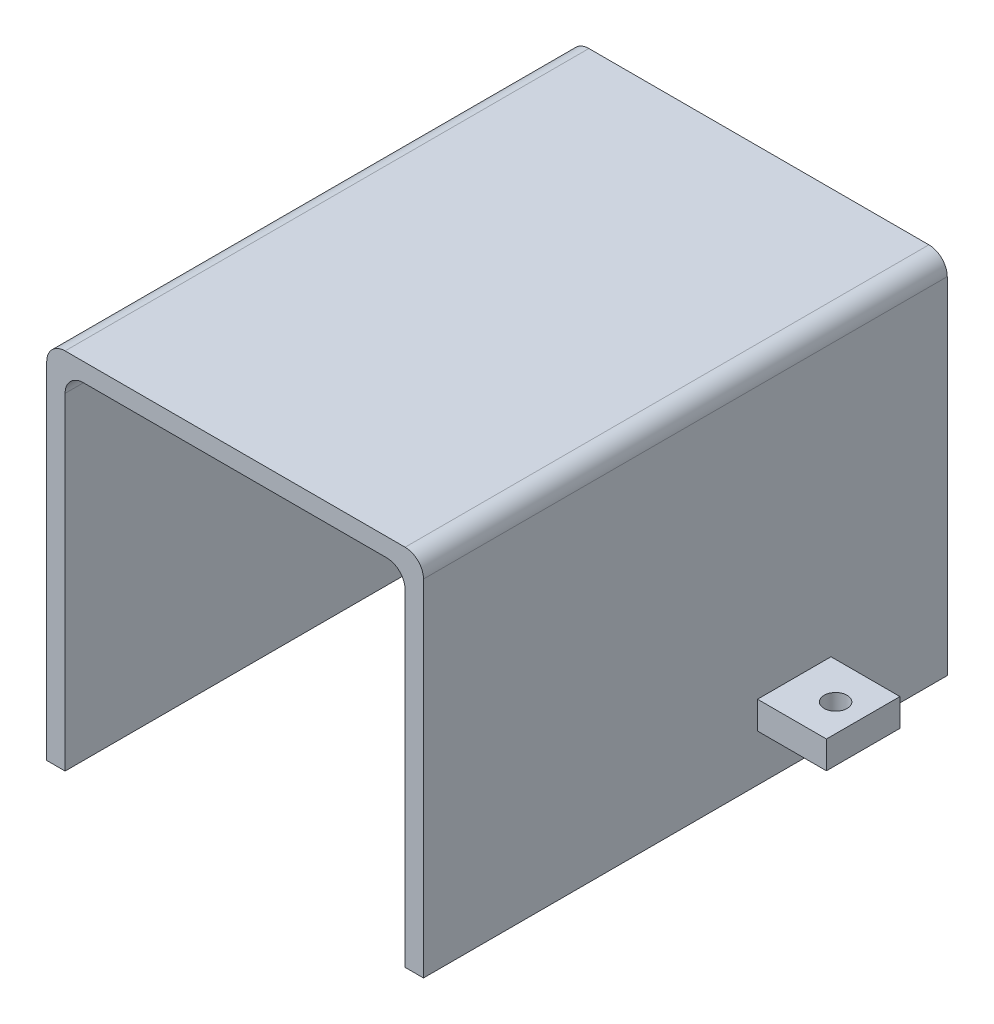
ISO-10303-21;
HEADER;
FILE_DESCRIPTION(('STEP AP214'),'2;1');
FILE_NAME('part.step','',(''),(''),'','','');
FILE_SCHEMA(('AUTOMOTIVE_DESIGN { 1 0 10303 214 1 1 1 1 }'));
ENDSEC;
DATA;
#1=APPLICATION_CONTEXT('core data for automotive mechanical design processes');
#2=APPLICATION_PROTOCOL_DEFINITION('international standard','automotive_design',2000,#1);
#3=PRODUCT_CONTEXT('',#1,'mechanical');
#4=PRODUCT('Part','Part','',(#3));
#5=PRODUCT_RELATED_PRODUCT_CATEGORY('part','',(#4));
#6=PRODUCT_DEFINITION_FORMATION('','',#4);
#7=PRODUCT_DEFINITION_CONTEXT('part definition',#1,'design');
#8=PRODUCT_DEFINITION('design','',#6,#7);
#9=PRODUCT_DEFINITION_SHAPE('','',#8);
#10=(LENGTH_UNIT() NAMED_UNIT(*) SI_UNIT(.MILLI.,.METRE.));
#11=(NAMED_UNIT(*) PLANE_ANGLE_UNIT() SI_UNIT($,.RADIAN.));
#12=(NAMED_UNIT(*) SI_UNIT($,.STERADIAN.) SOLID_ANGLE_UNIT());
#13=UNCERTAINTY_MEASURE_WITH_UNIT(LENGTH_MEASURE(1.E-05),#10,'distance_accuracy_value','');
#14=(GEOMETRIC_REPRESENTATION_CONTEXT(3) GLOBAL_UNCERTAINTY_ASSIGNED_CONTEXT((#13)) GLOBAL_UNIT_ASSIGNED_CONTEXT((#10,
#11,#12)) REPRESENTATION_CONTEXT('',''));
#15=CARTESIAN_POINT('',(0.,0.,0.));
#16=DIRECTION('',(0.,0.,1.));
#17=DIRECTION('',(1.,0.,0.));
#18=AXIS2_PLACEMENT_3D('',#15,#16,#17);
#19=CARTESIAN_POINT('',(-20.5,-5.5,-4.00000000000001));
#20=DIRECTION('',(0.,0.,-1.));
#21=DIRECTION('',(-1.,0.,0.));
#22=AXIS2_PLACEMENT_3D('',#19,#20,#21);
#23=PLANE('',#22);
#24=DIRECTION('',(1.,0.,0.));
#25=VECTOR('',#24,1.);
#26=CARTESIAN_POINT('',(-20.5,-8.5,-4.00000000000001));
#27=LINE('',#26,#25);
#28=CARTESIAN_POINT('',(-28.,-8.5,-3.99999999999999));
#29=VERTEX_POINT('',#28);
#30=CARTESIAN_POINT('',(-20.5,-8.5,-4.00000000000001));
#31=VERTEX_POINT('',#30);
#32=EDGE_CURVE('E111',#29,#31,#27,.T.);
#33=ORIENTED_EDGE('',*,*,#32,.F.);
#34=DIRECTION('',(0.,-1.,0.));
#35=VECTOR('',#34,1.);
#36=CARTESIAN_POINT('',(-28.,-5.5,-3.99999999999999));
#37=LINE('',#36,#35);
#38=CARTESIAN_POINT('',(-28.,-5.5,-3.99999999999999));
#39=VERTEX_POINT('',#38);
#40=EDGE_CURVE('E12',#39,#29,#37,.T.);
#41=ORIENTED_EDGE('',*,*,#40,.F.);
#42=DIRECTION('',(1.,0.,0.));
#43=VECTOR('',#42,1.);
#44=CARTESIAN_POINT('',(-20.5,-5.5,-4.00000000000001));
#45=LINE('',#44,#43);
#46=CARTESIAN_POINT('',(-20.5,-5.5,-4.00000000000001));
#47=VERTEX_POINT('',#46);
#48=EDGE_CURVE('E104',#39,#47,#45,.T.);
#49=ORIENTED_EDGE('',*,*,#48,.T.);
#50=DIRECTION('',(0.,-1.,0.));
#51=VECTOR('',#50,1.);
#52=CARTESIAN_POINT('',(-20.5,-5.5,-4.00000000000001));
#53=LINE('',#52,#51);
#54=EDGE_CURVE('E49',#47,#31,#53,.T.);
#55=ORIENTED_EDGE('',*,*,#54,.T.);
#56=EDGE_LOOP('',(#33,#41,#49,#55));
#57=FACE_BOUND('',#56,.T.);
#58=ADVANCED_FACE('F46',(#57),#23,.T.);
#59=CARTESIAN_POINT('',(-28.,-5.5,-3.99999999999999));
#60=DIRECTION('',(-1.,0.,0.));
#61=DIRECTION('',(0.,0.,1.));
#62=AXIS2_PLACEMENT_3D('',#59,#60,#61);
#63=PLANE('',#62);
#64=DIRECTION('',(0.,0.,-1.));
#65=VECTOR('',#64,1.);
#66=CARTESIAN_POINT('',(-28.,-8.5,-3.99999999999999));
#67=LINE('',#66,#65);
#68=CARTESIAN_POINT('',(-28.,-8.5,3.99999999999999));
#69=VERTEX_POINT('',#68);
#70=EDGE_CURVE('E106',#69,#29,#67,.T.);
#71=ORIENTED_EDGE('',*,*,#70,.F.);
#72=DIRECTION('',(0.,-1.,0.));
#73=VECTOR('',#72,1.);
#74=CARTESIAN_POINT('',(-28.,-5.5,3.99999999999999));
#75=LINE('',#74,#73);
#76=CARTESIAN_POINT('',(-28.,-5.5,3.99999999999999));
#77=VERTEX_POINT('',#76);
#78=EDGE_CURVE('E55',#77,#69,#75,.T.);
#79=ORIENTED_EDGE('',*,*,#78,.F.);
#80=DIRECTION('',(0.,0.,-1.));
#81=VECTOR('',#80,1.);
#82=CARTESIAN_POINT('',(-28.,-5.5,-3.99999999999999));
#83=LINE('',#82,#81);
#84=EDGE_CURVE('E101',#77,#39,#83,.T.);
#85=ORIENTED_EDGE('',*,*,#84,.T.);
#86=ORIENTED_EDGE('',*,*,#40,.T.);
#87=EDGE_LOOP('',(#71,#79,#85,#86));
#88=FACE_BOUND('',#87,.T.);
#89=ADVANCED_FACE('F122',(#88),#63,.T.);
#90=CARTESIAN_POINT('',(-20.5,-5.5,4.00000000000001));
#91=DIRECTION('',(0.,0.,1.));
#92=DIRECTION('',(1.,0.,0.));
#93=AXIS2_PLACEMENT_3D('',#90,#91,#92);
#94=PLANE('',#93);
#95=DIRECTION('',(-1.,0.,0.));
#96=VECTOR('',#95,1.);
#97=CARTESIAN_POINT('',(-20.5,-8.5,4.00000000000001));
#98=LINE('',#97,#96);
#99=CARTESIAN_POINT('',(-20.5,-8.5,4.00000000000001));
#100=VERTEX_POINT('',#99);
#101=EDGE_CURVE('E96',#100,#69,#98,.T.);
#102=ORIENTED_EDGE('',*,*,#101,.F.);
#103=DIRECTION('',(0.,-1.,0.));
#104=VECTOR('',#103,1.);
#105=CARTESIAN_POINT('',(-20.5,-5.5,4.00000000000001));
#106=LINE('',#105,#104);
#107=CARTESIAN_POINT('',(-20.5,-5.5,4.00000000000001));
#108=VERTEX_POINT('',#107);
#109=EDGE_CURVE('E91',#108,#100,#106,.T.);
#110=ORIENTED_EDGE('',*,*,#109,.F.);
#111=DIRECTION('',(-1.,0.,0.));
#112=VECTOR('',#111,1.);
#113=CARTESIAN_POINT('',(-20.5,-5.5,4.00000000000001));
#114=LINE('',#113,#112);
#115=EDGE_CURVE('E94',#108,#77,#114,.T.);
#116=ORIENTED_EDGE('',*,*,#115,.T.);
#117=ORIENTED_EDGE('',*,*,#78,.T.);
#118=EDGE_LOOP('',(#102,#110,#116,#117));
#119=FACE_BOUND('',#118,.T.);
#120=ADVANCED_FACE('F93',(#119),#94,.T.);
#121=CARTESIAN_POINT('',(-20.5,-5.5,-4.00000000000001));
#122=DIRECTION('',(1.,0.,0.));
#123=DIRECTION('',(0.,0.,-1.));
#124=AXIS2_PLACEMENT_3D('',#121,#122,#123);
#125=PLANE('',#124);
#126=DIRECTION('',(0.,0.,1.));
#127=VECTOR('',#126,1.);
#128=CARTESIAN_POINT('',(-20.5,-8.5,-4.00000000000001));
#129=LINE('',#128,#127);
#130=EDGE_CURVE('E114',#31,#100,#129,.T.);
#131=ORIENTED_EDGE('',*,*,#130,.F.);
#132=ORIENTED_EDGE('',*,*,#54,.F.);
#133=DIRECTION('',(0.,0.,1.));
#134=VECTOR('',#133,1.);
#135=CARTESIAN_POINT('',(-20.5,-5.5,-4.00000000000001));
#136=LINE('',#135,#134);
#137=EDGE_CURVE('E100',#47,#108,#136,.T.);
#138=ORIENTED_EDGE('',*,*,#137,.T.);
#139=ORIENTED_EDGE('',*,*,#109,.T.);
#140=EDGE_LOOP('',(#131,#132,#138,#139));
#141=FACE_BOUND('',#140,.T.);
#142=ADVANCED_FACE('F103',(#141),#125,.T.);
#143=CARTESIAN_POINT('',(0.,-5.5,0.));
#144=DIRECTION('',(0.,1.,0.));
#145=DIRECTION('',(0.,0.,1.));
#146=AXIS2_PLACEMENT_3D('',#143,#144,#145);
#147=PLANE('',#146);
#148=CARTESIAN_POINT('',(-25.,-5.5,0.));
#149=DIRECTION('',(0.,-1.,0.));
#150=DIRECTION('',(0.,0.,-1.));
#151=AXIS2_PLACEMENT_3D('',#148,#149,#150);
#152=CIRCLE('',#151,1.25);
#153=CARTESIAN_POINT('',(-25.,-5.5,-1.25000000000001));
#154=VERTEX_POINT('',#153);
#155=EDGE_CURVE('E115',#154,#154,#152,.T.);
#156=ORIENTED_EDGE('',*,*,#155,.T.);
#157=EDGE_LOOP('',(#156));
#158=FACE_BOUND('',#157,.T.);
#159=ORIENTED_EDGE('',*,*,#48,.F.);
#160=ORIENTED_EDGE('',*,*,#84,.F.);
#161=ORIENTED_EDGE('',*,*,#115,.F.);
#162=ORIENTED_EDGE('',*,*,#137,.F.);
#163=EDGE_LOOP('',(#159,#160,#161,#162));
#164=FACE_BOUND('',#163,.T.);
#165=ADVANCED_FACE('F99',(#158,#164),#147,.T.);
#166=CARTESIAN_POINT('',(0.,-8.5,0.));
#167=DIRECTION('',(0.,1.,0.));
#168=DIRECTION('',(0.,0.,1.));
#169=AXIS2_PLACEMENT_3D('',#166,#167,#168);
#170=PLANE('',#169);
#171=CARTESIAN_POINT('',(-25.,-8.5,0.));
#172=DIRECTION('',(0.,-1.,0.));
#173=DIRECTION('',(0.,0.,-1.));
#174=AXIS2_PLACEMENT_3D('',#171,#172,#173);
#175=CIRCLE('',#174,1.24999999999999);
#176=CARTESIAN_POINT('',(-25.,-8.5,-1.25));
#177=VERTEX_POINT('',#176);
#178=EDGE_CURVE('E152',#177,#177,#175,.T.);
#179=ORIENTED_EDGE('',*,*,#178,.F.);
#180=EDGE_LOOP('',(#179));
#181=FACE_BOUND('',#180,.T.);
#182=ORIENTED_EDGE('',*,*,#32,.T.);
#183=ORIENTED_EDGE('',*,*,#130,.T.);
#184=ORIENTED_EDGE('',*,*,#101,.T.);
#185=ORIENTED_EDGE('',*,*,#70,.T.);
#186=EDGE_LOOP('',(#182,#183,#184,#185));
#187=FACE_BOUND('',#186,.T.);
#188=ADVANCED_FACE('F121',(#181,#187),#170,.F.);
#189=CARTESIAN_POINT('',(-25.,-8.5,0.));
#190=DIRECTION('',(0.,-1.,0.));
#191=DIRECTION('',(0.,0.,-1.));
#192=AXIS2_PLACEMENT_3D('',#189,#190,#191);
#193=CYLINDRICAL_SURFACE('',#192,1.24999999999999);
#194=ORIENTED_EDGE('',*,*,#155,.F.);
#195=EDGE_LOOP('',(#194));
#196=FACE_BOUND('',#195,.T.);
#197=ORIENTED_EDGE('',*,*,#178,.T.);
#198=EDGE_LOOP('',(#197));
#199=FACE_BOUND('',#198,.T.);
#200=ADVANCED_FACE('F140',(#196,#199),#193,.F.);
#201=CLOSED_SHELL('',(#58,#89,#120,#142,#165,#188,#200));
#202=MANIFOLD_SOLID_BREP('B2',#201);
#203=CARTESIAN_POINT('',(20.5,-5.5,-4.));
#204=DIRECTION('',(-1.,0.,0.));
#205=DIRECTION('',(0.,0.,1.));
#206=AXIS2_PLACEMENT_3D('',#203,#204,#205);
#207=PLANE('',#206);
#208=DIRECTION('',(0.,0.,-1.));
#209=VECTOR('',#208,1.);
#210=CARTESIAN_POINT('',(20.5,-8.5,-4.));
#211=LINE('',#210,#209);
#212=CARTESIAN_POINT('',(20.5,-8.5,4.));
#213=VERTEX_POINT('',#212);
#214=CARTESIAN_POINT('',(20.5,-8.5,-4.));
#215=VERTEX_POINT('',#214);
#216=EDGE_CURVE('E265',#213,#215,#211,.T.);
#217=ORIENTED_EDGE('',*,*,#216,.F.);
#218=DIRECTION('',(0.,-1.,0.));
#219=VECTOR('',#218,1.);
#220=CARTESIAN_POINT('',(20.5,-5.5,4.));
#221=LINE('',#220,#219);
#222=CARTESIAN_POINT('',(20.5,-5.5,4.));
#223=VERTEX_POINT('',#222);
#224=EDGE_CURVE('E44',#223,#213,#221,.T.);
#225=ORIENTED_EDGE('',*,*,#224,.F.);
#226=DIRECTION('',(0.,0.,-1.));
#227=VECTOR('',#226,1.);
#228=CARTESIAN_POINT('',(20.5,-5.5,-4.));
#229=LINE('',#228,#227);
#230=CARTESIAN_POINT('',(20.5,-5.5,-4.));
#231=VERTEX_POINT('',#230);
#232=EDGE_CURVE('E258',#223,#231,#229,.T.);
#233=ORIENTED_EDGE('',*,*,#232,.T.);
#234=DIRECTION('',(0.,-1.,0.));
#235=VECTOR('',#234,1.);
#236=CARTESIAN_POINT('',(20.5,-5.5,-4.));
#237=LINE('',#236,#235);
#238=EDGE_CURVE('E203',#231,#215,#237,.T.);
#239=ORIENTED_EDGE('',*,*,#238,.T.);
#240=EDGE_LOOP('',(#217,#225,#233,#239));
#241=FACE_BOUND('',#240,.T.);
#242=ADVANCED_FACE('F200',(#241),#207,.T.);
#243=CARTESIAN_POINT('',(20.5,-5.5,4.));
#244=DIRECTION('',(0.,0.,1.));
#245=DIRECTION('',(1.,0.,0.));
#246=AXIS2_PLACEMENT_3D('',#243,#244,#245);
#247=PLANE('',#246);
#248=DIRECTION('',(-1.,0.,0.));
#249=VECTOR('',#248,1.);
#250=CARTESIAN_POINT('',(20.5,-8.5,4.));
#251=LINE('',#250,#249);
#252=CARTESIAN_POINT('',(28.,-8.5,4.));
#253=VERTEX_POINT('',#252);
#254=EDGE_CURVE('E260',#253,#213,#251,.T.);
#255=ORIENTED_EDGE('',*,*,#254,.F.);
#256=DIRECTION('',(0.,-1.,0.));
#257=VECTOR('',#256,1.);
#258=CARTESIAN_POINT('',(28.,-5.5,4.));
#259=LINE('',#258,#257);
#260=CARTESIAN_POINT('',(28.,-5.5,4.));
#261=VERTEX_POINT('',#260);
#262=EDGE_CURVE('E209',#261,#253,#259,.T.);
#263=ORIENTED_EDGE('',*,*,#262,.F.);
#264=DIRECTION('',(-1.,0.,0.));
#265=VECTOR('',#264,1.);
#266=CARTESIAN_POINT('',(20.5,-5.5,4.));
#267=LINE('',#266,#265);
#268=EDGE_CURVE('E255',#261,#223,#267,.T.);
#269=ORIENTED_EDGE('',*,*,#268,.T.);
#270=ORIENTED_EDGE('',*,*,#224,.T.);
#271=EDGE_LOOP('',(#255,#263,#269,#270));
#272=FACE_BOUND('',#271,.T.);
#273=ADVANCED_FACE('F276',(#272),#247,.T.);
#274=CARTESIAN_POINT('',(28.,-5.5,-4.));
#275=DIRECTION('',(1.,0.,0.));
#276=DIRECTION('',(0.,0.,-1.));
#277=AXIS2_PLACEMENT_3D('',#274,#275,#276);
#278=PLANE('',#277);
#279=DIRECTION('',(0.,0.,1.));
#280=VECTOR('',#279,1.);
#281=CARTESIAN_POINT('',(28.,-8.5,-4.));
#282=LINE('',#281,#280);
#283=CARTESIAN_POINT('',(28.,-8.5,-4.));
#284=VERTEX_POINT('',#283);
#285=EDGE_CURVE('E250',#284,#253,#282,.T.);
#286=ORIENTED_EDGE('',*,*,#285,.F.);
#287=DIRECTION('',(0.,-1.,0.));
#288=VECTOR('',#287,1.);
#289=CARTESIAN_POINT('',(28.,-5.5,-4.));
#290=LINE('',#289,#288);
#291=CARTESIAN_POINT('',(28.,-5.5,-4.));
#292=VERTEX_POINT('',#291);
#293=EDGE_CURVE('E245',#292,#284,#290,.T.);
#294=ORIENTED_EDGE('',*,*,#293,.F.);
#295=DIRECTION('',(0.,0.,1.));
#296=VECTOR('',#295,1.);
#297=CARTESIAN_POINT('',(28.,-5.5,-4.));
#298=LINE('',#297,#296);
#299=EDGE_CURVE('E248',#292,#261,#298,.T.);
#300=ORIENTED_EDGE('',*,*,#299,.T.);
#301=ORIENTED_EDGE('',*,*,#262,.T.);
#302=EDGE_LOOP('',(#286,#294,#300,#301));
#303=FACE_BOUND('',#302,.T.);
#304=ADVANCED_FACE('F247',(#303),#278,.T.);
#305=CARTESIAN_POINT('',(20.5,-5.5,-4.));
#306=DIRECTION('',(0.,0.,-1.));
#307=DIRECTION('',(-1.,0.,0.));
#308=AXIS2_PLACEMENT_3D('',#305,#306,#307);
#309=PLANE('',#308);
#310=DIRECTION('',(1.,0.,0.));
#311=VECTOR('',#310,1.);
#312=CARTESIAN_POINT('',(20.5,-8.5,-4.));
#313=LINE('',#312,#311);
#314=EDGE_CURVE('E268',#215,#284,#313,.T.);
#315=ORIENTED_EDGE('',*,*,#314,.F.);
#316=ORIENTED_EDGE('',*,*,#238,.F.);
#317=DIRECTION('',(1.,0.,0.));
#318=VECTOR('',#317,1.);
#319=CARTESIAN_POINT('',(20.5,-5.5,-4.));
#320=LINE('',#319,#318);
#321=EDGE_CURVE('E254',#231,#292,#320,.T.);
#322=ORIENTED_EDGE('',*,*,#321,.T.);
#323=ORIENTED_EDGE('',*,*,#293,.T.);
#324=EDGE_LOOP('',(#315,#316,#322,#323));
#325=FACE_BOUND('',#324,.T.);
#326=ADVANCED_FACE('F257',(#325),#309,.T.);
#327=CARTESIAN_POINT('',(0.,-5.5,0.));
#328=DIRECTION('',(0.,1.,0.));
#329=DIRECTION('',(0.,0.,1.));
#330=AXIS2_PLACEMENT_3D('',#327,#328,#329);
#331=PLANE('',#330);
#332=CARTESIAN_POINT('',(25.,-5.5,0.));
#333=DIRECTION('',(0.,-1.,0.));
#334=DIRECTION('',(0.,0.,-1.));
#335=AXIS2_PLACEMENT_3D('',#332,#333,#334);
#336=CIRCLE('',#335,1.25);
#337=CARTESIAN_POINT('',(25.,-5.5,-1.25));
#338=VERTEX_POINT('',#337);
#339=EDGE_CURVE('E269',#338,#338,#336,.T.);
#340=ORIENTED_EDGE('',*,*,#339,.T.);
#341=EDGE_LOOP('',(#340));
#342=FACE_BOUND('',#341,.T.);
#343=ORIENTED_EDGE('',*,*,#232,.F.);
#344=ORIENTED_EDGE('',*,*,#268,.F.);
#345=ORIENTED_EDGE('',*,*,#299,.F.);
#346=ORIENTED_EDGE('',*,*,#321,.F.);
#347=EDGE_LOOP('',(#343,#344,#345,#346));
#348=FACE_BOUND('',#347,.T.);
#349=ADVANCED_FACE('F253',(#342,#348),#331,.T.);
#350=CARTESIAN_POINT('',(0.,-8.5,0.));
#351=DIRECTION('',(0.,1.,0.));
#352=DIRECTION('',(0.,0.,1.));
#353=AXIS2_PLACEMENT_3D('',#350,#351,#352);
#354=PLANE('',#353);
#355=CARTESIAN_POINT('',(25.,-8.5,0.));
#356=DIRECTION('',(0.,-1.,0.));
#357=DIRECTION('',(0.,0.,-1.));
#358=AXIS2_PLACEMENT_3D('',#355,#356,#357);
#359=CIRCLE('',#358,1.24999999999999);
#360=CARTESIAN_POINT('',(25.,-8.5,-1.24999999999999));
#361=VERTEX_POINT('',#360);
#362=EDGE_CURVE('E306',#361,#361,#359,.T.);
#363=ORIENTED_EDGE('',*,*,#362,.F.);
#364=EDGE_LOOP('',(#363));
#365=FACE_BOUND('',#364,.T.);
#366=ORIENTED_EDGE('',*,*,#216,.T.);
#367=ORIENTED_EDGE('',*,*,#314,.T.);
#368=ORIENTED_EDGE('',*,*,#285,.T.);
#369=ORIENTED_EDGE('',*,*,#254,.T.);
#370=EDGE_LOOP('',(#366,#367,#368,#369));
#371=FACE_BOUND('',#370,.T.);
#372=ADVANCED_FACE('F275',(#365,#371),#354,.F.);
#373=CARTESIAN_POINT('',(25.,-8.5,0.));
#374=DIRECTION('',(0.,-1.,0.));
#375=DIRECTION('',(0.,0.,-1.));
#376=AXIS2_PLACEMENT_3D('',#373,#374,#375);
#377=CYLINDRICAL_SURFACE('',#376,1.24999999999999);
#378=ORIENTED_EDGE('',*,*,#339,.F.);
#379=EDGE_LOOP('',(#378));
#380=FACE_BOUND('',#379,.T.);
#381=ORIENTED_EDGE('',*,*,#362,.T.);
#382=EDGE_LOOP('',(#381));
#383=FACE_BOUND('',#382,.T.);
#384=ADVANCED_FACE('F294',(#380,#383),#377,.F.);
#385=CLOSED_SHELL('',(#242,#273,#304,#326,#349,#372,#384));
#386=MANIFOLD_SOLID_BREP('B6',#385);
#387=CARTESIAN_POINT('',(18.5,24.,-16.65));
#388=DIRECTION('',(-1.,0.,0.));
#389=DIRECTION('',(0.,0.,1.));
#390=AXIS2_PLACEMENT_3D('',#387,#388,#389);
#391=PLANE('',#390);
#392=DIRECTION('',(0.,-1.,0.));
#393=VECTOR('',#392,1.);
#394=CARTESIAN_POINT('',(18.5,24.,40.35));
#395=LINE('',#394,#393);
#396=CARTESIAN_POINT('',(18.5,22.,40.35));
#397=VERTEX_POINT('',#396);
#398=CARTESIAN_POINT('',(18.5,-13.6,40.35));
#399=VERTEX_POINT('',#398);
#400=EDGE_CURVE('E436',#397,#399,#395,.T.);
#401=ORIENTED_EDGE('',*,*,#400,.F.);
#402=DIRECTION('',(0.,0.,1.));
#403=VECTOR('',#402,1.);
#404=CARTESIAN_POINT('',(18.5,22.,-16.65));
#405=LINE('',#404,#403);
#406=CARTESIAN_POINT('',(18.5,22.,-16.65));
#407=VERTEX_POINT('',#406);
#408=EDGE_CURVE('E505',#397,#407,#405,.F.);
#409=ORIENTED_EDGE('',*,*,#408,.T.);
#410=DIRECTION('',(0.,-1.,0.));
#411=VECTOR('',#410,1.);
#412=CARTESIAN_POINT('',(18.5,24.,-16.65));
#413=LINE('',#412,#411);
#414=CARTESIAN_POINT('',(18.5,-13.6,-16.65));
#415=VERTEX_POINT('',#414);
#416=EDGE_CURVE('E452',#407,#415,#413,.T.);
#417=ORIENTED_EDGE('',*,*,#416,.T.);
#418=DIRECTION('',(0.,0.,1.));
#419=VECTOR('',#418,1.);
#420=CARTESIAN_POINT('',(18.5,-13.6,-16.65));
#421=LINE('',#420,#419);
#422=EDGE_CURVE('E450',#415,#399,#421,.T.);
#423=ORIENTED_EDGE('',*,*,#422,.T.);
#424=EDGE_LOOP('',(#401,#409,#417,#423));
#425=FACE_BOUND('',#424,.T.);
#426=ADVANCED_FACE('F345',(#425),#391,.T.);
#427=CARTESIAN_POINT('',(-18.5,24.,-16.65));
#428=DIRECTION('',(0.,-1.,0.));
#429=DIRECTION('',(0.,0.,-1.));
#430=AXIS2_PLACEMENT_3D('',#427,#428,#429);
#431=PLANE('',#430);
#432=DIRECTION('',(1.,0.,0.));
#433=VECTOR('',#432,1.);
#434=CARTESIAN_POINT('',(-18.5,24.,-16.65));
#435=LINE('',#434,#433);
#436=CARTESIAN_POINT('',(-16.5,24.,-16.65));
#437=VERTEX_POINT('',#436);
#438=CARTESIAN_POINT('',(16.5,24.,-16.65));
#439=VERTEX_POINT('',#438);
#440=EDGE_CURVE('E457',#437,#439,#435,.T.);
#441=ORIENTED_EDGE('',*,*,#440,.T.);
#442=DIRECTION('',(0.,0.,1.));
#443=VECTOR('',#442,1.);
#444=CARTESIAN_POINT('',(16.5,24.,40.35));
#445=LINE('',#444,#443);
#446=CARTESIAN_POINT('',(16.5,24.,40.35));
#447=VERTEX_POINT('',#446);
#448=EDGE_CURVE('E502',#439,#447,#445,.T.);
#449=ORIENTED_EDGE('',*,*,#448,.T.);
#450=DIRECTION('',(1.,0.,0.));
#451=VECTOR('',#450,1.);
#452=CARTESIAN_POINT('',(-18.5,24.,40.35));
#453=LINE('',#452,#451);
#454=CARTESIAN_POINT('',(-16.5,24.,40.35));
#455=VERTEX_POINT('',#454);
#456=EDGE_CURVE('E474',#455,#447,#453,.T.);
#457=ORIENTED_EDGE('',*,*,#456,.F.);
#458=DIRECTION('',(0.,0.,1.));
#459=VECTOR('',#458,1.);
#460=CARTESIAN_POINT('',(-16.5,24.,-16.65));
#461=LINE('',#460,#459);
#462=EDGE_CURVE('E496',#455,#437,#461,.F.);
#463=ORIENTED_EDGE('',*,*,#462,.T.);
#464=EDGE_LOOP('',(#441,#449,#457,#463));
#465=FACE_BOUND('',#464,.T.);
#466=ADVANCED_FACE('F534',(#465),#431,.T.);
#467=CARTESIAN_POINT('',(-18.5,24.,-16.65));
#468=DIRECTION('',(1.,0.,0.));
#469=DIRECTION('',(0.,0.,-1.));
#470=AXIS2_PLACEMENT_3D('',#467,#468,#469);
#471=PLANE('',#470);
#472=DIRECTION('',(0.,1.,0.));
#473=VECTOR('',#472,1.);
#474=CARTESIAN_POINT('',(-18.5,24.,-16.65));
#475=LINE('',#474,#473);
#476=CARTESIAN_POINT('',(-18.5,-13.6,-16.65));
#477=VERTEX_POINT('',#476);
#478=CARTESIAN_POINT('',(-18.5,22.,-16.65));
#479=VERTEX_POINT('',#478);
#480=EDGE_CURVE('E489',#477,#479,#475,.T.);
#481=ORIENTED_EDGE('',*,*,#480,.T.);
#482=DIRECTION('',(0.,0.,1.));
#483=VECTOR('',#482,1.);
#484=CARTESIAN_POINT('',(-18.5,22.,40.35));
#485=LINE('',#484,#483);
#486=CARTESIAN_POINT('',(-18.5,22.,40.35));
#487=VERTEX_POINT('',#486);
#488=EDGE_CURVE('E507',#479,#487,#485,.T.);
#489=ORIENTED_EDGE('',*,*,#488,.T.);
#490=DIRECTION('',(0.,1.,0.));
#491=VECTOR('',#490,1.);
#492=CARTESIAN_POINT('',(-18.5,24.,40.35));
#493=LINE('',#492,#491);
#494=CARTESIAN_POINT('',(-18.5,-13.6,40.35));
#495=VERTEX_POINT('',#494);
#496=EDGE_CURVE('E471',#495,#487,#493,.T.);
#497=ORIENTED_EDGE('',*,*,#496,.F.);
#498=DIRECTION('',(0.,0.,1.));
#499=VECTOR('',#498,1.);
#500=CARTESIAN_POINT('',(-18.5,-13.6,-16.65));
#501=LINE('',#500,#499);
#502=EDGE_CURVE('E494',#477,#495,#501,.T.);
#503=ORIENTED_EDGE('',*,*,#502,.F.);
#504=EDGE_LOOP('',(#481,#489,#497,#503));
#505=FACE_BOUND('',#504,.T.);
#506=ADVANCED_FACE('F543',(#505),#471,.T.);
#507=CARTESIAN_POINT('',(-20.5,-13.6,-16.65));
#508=DIRECTION('',(0.,-1.,0.));
#509=DIRECTION('',(0.,0.,-1.));
#510=AXIS2_PLACEMENT_3D('',#507,#508,#509);
#511=PLANE('',#510);
#512=ORIENTED_EDGE('',*,*,#502,.T.);
#513=DIRECTION('',(1.,0.,0.));
#514=VECTOR('',#513,1.);
#515=CARTESIAN_POINT('',(-20.5,-13.6,40.35));
#516=LINE('',#515,#514);
#517=CARTESIAN_POINT('',(-20.5,-13.6,40.35));
#518=VERTEX_POINT('',#517);
#519=EDGE_CURVE('E468',#518,#495,#516,.T.);
#520=ORIENTED_EDGE('',*,*,#519,.F.);
#521=DIRECTION('',(0.,0.,1.));
#522=VECTOR('',#521,1.);
#523=CARTESIAN_POINT('',(-20.5,-13.6,-16.65));
#524=LINE('',#523,#522);
#525=CARTESIAN_POINT('',(-20.5,-13.6,-16.65));
#526=VERTEX_POINT('',#525);
#527=EDGE_CURVE('E497',#526,#518,#524,.T.);
#528=ORIENTED_EDGE('',*,*,#527,.F.);
#529=DIRECTION('',(1.,0.,0.));
#530=VECTOR('',#529,1.);
#531=CARTESIAN_POINT('',(-20.5,-13.6,-16.65));
#532=LINE('',#531,#530);
#533=EDGE_CURVE('E486',#526,#477,#532,.T.);
#534=ORIENTED_EDGE('',*,*,#533,.T.);
#535=EDGE_LOOP('',(#512,#520,#528,#534));
#536=FACE_BOUND('',#535,.T.);
#537=ADVANCED_FACE('F546',(#536),#511,.T.);
#538=CARTESIAN_POINT('',(-20.5,-13.6,-16.65));
#539=DIRECTION('',(-1.,0.,0.));
#540=DIRECTION('',(0.,0.,1.));
#541=AXIS2_PLACEMENT_3D('',#538,#539,#540);
#542=PLANE('',#541);
#543=DIRECTION('',(0.,-1.,0.));
#544=VECTOR('',#543,1.);
#545=CARTESIAN_POINT('',(-20.5,-13.6,40.35));
#546=LINE('',#545,#544);
#547=CARTESIAN_POINT('',(-20.5,24.,40.35));
#548=VERTEX_POINT('',#547);
#549=EDGE_CURVE('E466',#548,#518,#546,.T.);
#550=ORIENTED_EDGE('',*,*,#549,.F.);
#551=DIRECTION('',(0.,0.,1.));
#552=VECTOR('',#551,1.);
#553=CARTESIAN_POINT('',(-20.5,24.,-16.65));
#554=LINE('',#553,#552);
#555=CARTESIAN_POINT('',(-20.5,24.,-16.65));
#556=VERTEX_POINT('',#555);
#557=EDGE_CURVE('E368',#548,#556,#554,.F.);
#558=ORIENTED_EDGE('',*,*,#557,.T.);
#559=DIRECTION('',(0.,-1.,0.));
#560=VECTOR('',#559,1.);
#561=CARTESIAN_POINT('',(-20.5,-13.6,-16.65));
#562=LINE('',#561,#560);
#563=EDGE_CURVE('E484',#556,#526,#562,.T.);
#564=ORIENTED_EDGE('',*,*,#563,.T.);
#565=ORIENTED_EDGE('',*,*,#527,.T.);
#566=EDGE_LOOP('',(#550,#558,#564,#565));
#567=FACE_BOUND('',#566,.T.);
#568=ADVANCED_FACE('F548',(#567),#542,.T.);
#569=CARTESIAN_POINT('',(-20.5,26.,-16.65));
#570=DIRECTION('',(0.,1.,0.));
#571=DIRECTION('',(0.,0.,1.));
#572=AXIS2_PLACEMENT_3D('',#569,#570,#571);
#573=PLANE('',#572);
#574=DIRECTION('',(-1.,0.,0.));
#575=VECTOR('',#574,1.);
#576=CARTESIAN_POINT('',(-20.5,26.,-16.65));
#577=LINE('',#576,#575);
#578=CARTESIAN_POINT('',(18.5,26.,-16.65));
#579=VERTEX_POINT('',#578);
#580=CARTESIAN_POINT('',(-18.5,26.,-16.65));
#581=VERTEX_POINT('',#580);
#582=EDGE_CURVE('E481',#579,#581,#577,.T.);
#583=ORIENTED_EDGE('',*,*,#582,.T.);
#584=DIRECTION('',(0.,0.,1.));
#585=VECTOR('',#584,1.);
#586=CARTESIAN_POINT('',(-18.5,26.,-16.65));
#587=LINE('',#586,#585);
#588=CARTESIAN_POINT('',(-18.5,26.,40.35));
#589=VERTEX_POINT('',#588);
#590=EDGE_CURVE('E512',#581,#589,#587,.T.);
#591=ORIENTED_EDGE('',*,*,#590,.T.);
#592=DIRECTION('',(-1.,0.,0.));
#593=VECTOR('',#592,1.);
#594=CARTESIAN_POINT('',(-20.5,26.,40.35));
#595=LINE('',#594,#593);
#596=CARTESIAN_POINT('',(18.5,26.,40.35));
#597=VERTEX_POINT('',#596);
#598=EDGE_CURVE('E462',#597,#589,#595,.T.);
#599=ORIENTED_EDGE('',*,*,#598,.F.);
#600=DIRECTION('',(0.,0.,1.));
#601=VECTOR('',#600,1.);
#602=CARTESIAN_POINT('',(18.5,26.,-16.65));
#603=LINE('',#602,#601);
#604=EDGE_CURVE('E510',#597,#579,#603,.F.);
#605=ORIENTED_EDGE('',*,*,#604,.T.);
#606=EDGE_LOOP('',(#583,#591,#599,#605));
#607=FACE_BOUND('',#606,.T.);
#608=ADVANCED_FACE('F555',(#607),#573,.T.);
#609=CARTESIAN_POINT('',(20.5,-13.6,-16.65));
#610=DIRECTION('',(1.,0.,0.));
#611=DIRECTION('',(0.,0.,-1.));
#612=AXIS2_PLACEMENT_3D('',#609,#610,#611);
#613=PLANE('',#612);
#614=DIRECTION('',(0.,1.,0.));
#615=VECTOR('',#614,1.);
#616=CARTESIAN_POINT('',(20.5,-13.6,-16.65));
#617=LINE('',#616,#615);
#618=CARTESIAN_POINT('',(20.5,-13.6,-16.65));
#619=VERTEX_POINT('',#618);
#620=CARTESIAN_POINT('',(20.5,24.,-16.65));
#621=VERTEX_POINT('',#620);
#622=EDGE_CURVE('E479',#619,#621,#617,.T.);
#623=ORIENTED_EDGE('',*,*,#622,.T.);
#624=DIRECTION('',(0.,0.,1.));
#625=VECTOR('',#624,1.);
#626=CARTESIAN_POINT('',(20.5,24.,-16.65));
#627=LINE('',#626,#625);
#628=CARTESIAN_POINT('',(20.5,24.,40.35));
#629=VERTEX_POINT('',#628);
#630=EDGE_CURVE('E523',#621,#629,#627,.T.);
#631=ORIENTED_EDGE('',*,*,#630,.T.);
#632=DIRECTION('',(0.,1.,0.));
#633=VECTOR('',#632,1.);
#634=CARTESIAN_POINT('',(20.5,-13.6,40.35));
#635=LINE('',#634,#633);
#636=CARTESIAN_POINT('',(20.5,-13.6,40.35));
#637=VERTEX_POINT('',#636);
#638=EDGE_CURVE('E460',#637,#629,#635,.T.);
#639=ORIENTED_EDGE('',*,*,#638,.F.);
#640=DIRECTION('',(0.,0.,1.));
#641=VECTOR('',#640,1.);
#642=CARTESIAN_POINT('',(20.5,-13.6,-16.65));
#643=LINE('',#642,#641);
#644=EDGE_CURVE('E456',#619,#637,#643,.T.);
#645=ORIENTED_EDGE('',*,*,#644,.F.);
#646=EDGE_LOOP('',(#623,#631,#639,#645));
#647=FACE_BOUND('',#646,.T.);
#648=ADVANCED_FACE('F560',(#647),#613,.T.);
#649=CARTESIAN_POINT('',(18.5,-13.6,-16.65));
#650=DIRECTION('',(0.,-1.,0.));
#651=DIRECTION('',(0.,0.,-1.));
#652=AXIS2_PLACEMENT_3D('',#649,#650,#651);
#653=PLANE('',#652);
#654=ORIENTED_EDGE('',*,*,#644,.T.);
#655=DIRECTION('',(1.,0.,0.));
#656=VECTOR('',#655,1.);
#657=CARTESIAN_POINT('',(18.5,-13.6,40.35));
#658=LINE('',#657,#656);
#659=EDGE_CURVE('E442',#399,#637,#658,.T.);
#660=ORIENTED_EDGE('',*,*,#659,.F.);
#661=ORIENTED_EDGE('',*,*,#422,.F.);
#662=DIRECTION('',(1.,0.,0.));
#663=VECTOR('',#662,1.);
#664=CARTESIAN_POINT('',(18.5,-13.6,-16.65));
#665=LINE('',#664,#663);
#666=EDGE_CURVE('E477',#415,#619,#665,.T.);
#667=ORIENTED_EDGE('',*,*,#666,.T.);
#668=EDGE_LOOP('',(#654,#660,#661,#667));
#669=FACE_BOUND('',#668,.T.);
#670=ADVANCED_FACE('F459',(#669),#653,.T.);
#671=CARTESIAN_POINT('',(0.,0.,-16.65));
#672=DIRECTION('',(0.,0.,1.));
#673=DIRECTION('',(1.,0.,0.));
#674=AXIS2_PLACEMENT_3D('',#671,#672,#673);
#675=PLANE('',#674);
#676=ORIENTED_EDGE('',*,*,#563,.F.);
#677=CARTESIAN_POINT('',(-18.5,24.,-16.65));
#678=DIRECTION('',(0.,0.,1.));
#679=DIRECTION('',(1.,0.,0.));
#680=AXIS2_PLACEMENT_3D('',#677,#678,#679);
#681=CIRCLE('',#680,2.);
#682=EDGE_CURVE('E521',#556,#581,#681,.F.);
#683=ORIENTED_EDGE('',*,*,#682,.T.);
#684=ORIENTED_EDGE('',*,*,#582,.F.);
#685=CARTESIAN_POINT('',(18.5,24.,-16.65));
#686=DIRECTION('',(0.,0.,1.));
#687=DIRECTION('',(1.,0.,0.));
#688=AXIS2_PLACEMENT_3D('',#685,#686,#687);
#689=CIRCLE('',#688,2.);
#690=EDGE_CURVE('E360',#579,#621,#689,.F.);
#691=ORIENTED_EDGE('',*,*,#690,.T.);
#692=ORIENTED_EDGE('',*,*,#622,.F.);
#693=ORIENTED_EDGE('',*,*,#666,.F.);
#694=ORIENTED_EDGE('',*,*,#416,.F.);
#695=CARTESIAN_POINT('',(16.5,22.,-16.65));
#696=DIRECTION('',(0.,0.,1.));
#697=DIRECTION('',(1.,0.,0.));
#698=AXIS2_PLACEMENT_3D('',#695,#696,#697);
#699=CIRCLE('',#698,2.);
#700=EDGE_CURVE('E527',#407,#439,#699,.T.);
#701=ORIENTED_EDGE('',*,*,#700,.T.);
#702=ORIENTED_EDGE('',*,*,#440,.F.);
#703=CARTESIAN_POINT('',(-16.5,22.,-16.65));
#704=DIRECTION('',(0.,0.,1.));
#705=DIRECTION('',(1.,0.,0.));
#706=AXIS2_PLACEMENT_3D('',#703,#704,#705);
#707=CIRCLE('',#706,2.);
#708=EDGE_CURVE('E198',#437,#479,#707,.T.);
#709=ORIENTED_EDGE('',*,*,#708,.T.);
#710=ORIENTED_EDGE('',*,*,#480,.F.);
#711=ORIENTED_EDGE('',*,*,#533,.F.);
#712=EDGE_LOOP('',(#676,#683,#684,#691,#692,#693,#694,#701,#702,#709,#710,#711));
#713=FACE_BOUND('',#712,.T.);
#714=ADVANCED_FACE('F540',(#713),#675,.F.);
#715=CARTESIAN_POINT('',(0.,0.,40.35));
#716=DIRECTION('',(0.,0.,1.));
#717=DIRECTION('',(1.,0.,0.));
#718=AXIS2_PLACEMENT_3D('',#715,#716,#717);
#719=PLANE('',#718);
#720=ORIENTED_EDGE('',*,*,#598,.T.);
#721=CARTESIAN_POINT('',(-18.5,24.,40.35));
#722=DIRECTION('',(0.,0.,1.));
#723=DIRECTION('',(1.,0.,0.));
#724=AXIS2_PLACEMENT_3D('',#721,#722,#723);
#725=CIRCLE('',#724,2.);
#726=EDGE_CURVE('E517',#589,#548,#725,.T.);
#727=ORIENTED_EDGE('',*,*,#726,.T.);
#728=ORIENTED_EDGE('',*,*,#549,.T.);
#729=ORIENTED_EDGE('',*,*,#519,.T.);
#730=ORIENTED_EDGE('',*,*,#496,.T.);
#731=CARTESIAN_POINT('',(-16.5,22.,40.35));
#732=DIRECTION('',(0.,0.,1.));
#733=DIRECTION('',(1.,0.,0.));
#734=AXIS2_PLACEMENT_3D('',#731,#732,#733);
#735=CIRCLE('',#734,2.);
#736=EDGE_CURVE('E353',#487,#455,#735,.F.);
#737=ORIENTED_EDGE('',*,*,#736,.T.);
#738=ORIENTED_EDGE('',*,*,#456,.T.);
#739=CARTESIAN_POINT('',(16.5,22.,40.35));
#740=DIRECTION('',(0.,0.,1.));
#741=DIRECTION('',(1.,0.,0.));
#742=AXIS2_PLACEMENT_3D('',#739,#740,#741);
#743=CIRCLE('',#742,2.);
#744=EDGE_CURVE('E445',#447,#397,#743,.F.);
#745=ORIENTED_EDGE('',*,*,#744,.T.);
#746=ORIENTED_EDGE('',*,*,#400,.T.);
#747=ORIENTED_EDGE('',*,*,#659,.T.);
#748=ORIENTED_EDGE('',*,*,#638,.T.);
#749=CARTESIAN_POINT('',(18.5,24.,40.35));
#750=DIRECTION('',(0.,0.,1.));
#751=DIRECTION('',(1.,0.,0.));
#752=AXIS2_PLACEMENT_3D('',#749,#750,#751);
#753=CIRCLE('',#752,2.);
#754=EDGE_CURVE('E515',#629,#597,#753,.T.);
#755=ORIENTED_EDGE('',*,*,#754,.T.);
#756=EDGE_LOOP('',(#720,#727,#728,#729,#730,#737,#738,#745,#746,#747,#748,#755));
#757=FACE_BOUND('',#756,.T.);
#758=ADVANCED_FACE('F439',(#757),#719,.T.);
#759=CARTESIAN_POINT('',(16.5,22.,-16.65));
#760=DIRECTION('',(0.,0.,-1.));
#761=DIRECTION('',(-1.,0.,0.));
#762=AXIS2_PLACEMENT_3D('',#759,#760,#761);
#763=CYLINDRICAL_SURFACE('',#762,2.);
#764=ORIENTED_EDGE('',*,*,#700,.F.);
#765=ORIENTED_EDGE('',*,*,#408,.F.);
#766=ORIENTED_EDGE('',*,*,#744,.F.);
#767=ORIENTED_EDGE('',*,*,#448,.F.);
#768=EDGE_LOOP('',(#764,#765,#766,#767));
#769=FACE_BOUND('',#768,.T.);
#770=ADVANCED_FACE('F563',(#769),#763,.F.);
#771=CARTESIAN_POINT('',(-16.5,22.,-16.65));
#772=DIRECTION('',(0.,0.,-1.));
#773=DIRECTION('',(-1.,0.,0.));
#774=AXIS2_PLACEMENT_3D('',#771,#772,#773);
#775=CYLINDRICAL_SURFACE('',#774,2.);
#776=ORIENTED_EDGE('',*,*,#708,.F.);
#777=ORIENTED_EDGE('',*,*,#462,.F.);
#778=ORIENTED_EDGE('',*,*,#736,.F.);
#779=ORIENTED_EDGE('',*,*,#488,.F.);
#780=EDGE_LOOP('',(#776,#777,#778,#779));
#781=FACE_BOUND('',#780,.T.);
#782=ADVANCED_FACE('F538',(#781),#775,.F.);
#783=CARTESIAN_POINT('',(-18.5,24.,-16.65));
#784=DIRECTION('',(0.,0.,1.));
#785=DIRECTION('',(1.,0.,0.));
#786=AXIS2_PLACEMENT_3D('',#783,#784,#785);
#787=CYLINDRICAL_SURFACE('',#786,2.);
#788=ORIENTED_EDGE('',*,*,#682,.F.);
#789=ORIENTED_EDGE('',*,*,#557,.F.);
#790=ORIENTED_EDGE('',*,*,#726,.F.);
#791=ORIENTED_EDGE('',*,*,#590,.F.);
#792=EDGE_LOOP('',(#788,#789,#790,#791));
#793=FACE_BOUND('',#792,.T.);
#794=ADVANCED_FACE('F552',(#793),#787,.T.);
#795=CARTESIAN_POINT('',(18.5,24.,-16.65));
#796=DIRECTION('',(0.,0.,1.));
#797=DIRECTION('',(1.,0.,0.));
#798=AXIS2_PLACEMENT_3D('',#795,#796,#797);
#799=CYLINDRICAL_SURFACE('',#798,2.);
#800=ORIENTED_EDGE('',*,*,#690,.F.);
#801=ORIENTED_EDGE('',*,*,#604,.F.);
#802=ORIENTED_EDGE('',*,*,#754,.F.);
#803=ORIENTED_EDGE('',*,*,#630,.F.);
#804=EDGE_LOOP('',(#800,#801,#802,#803));
#805=FACE_BOUND('',#804,.T.);
#806=ADVANCED_FACE('F347',(#805),#799,.T.);
#807=CLOSED_SHELL('',(#426,#466,#506,#537,#568,#608,#648,#670,#714,#758,#770,#782,#794,#806));
#808=MANIFOLD_SOLID_BREP('B38',#807);
#809=ADVANCED_BREP_SHAPE_REPRESENTATION('',(#18,#202,#386,#808),#14);
#810=SHAPE_DEFINITION_REPRESENTATION(#9,#809);
ENDSEC;
END-ISO-10303-21;
